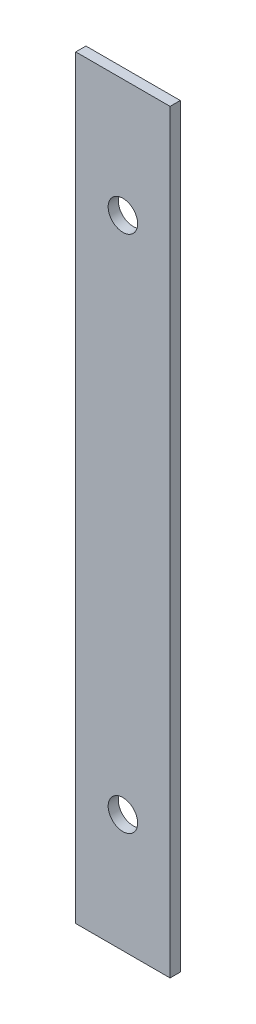
ISO-10303-21;
HEADER;
FILE_DESCRIPTION(('STEP AP214'),'2;1');
FILE_NAME('part.step','',(''),(''),'','','');
FILE_SCHEMA(('AUTOMOTIVE_DESIGN { 1 0 10303 214 1 1 1 1 }'));
ENDSEC;
DATA;
#1=APPLICATION_CONTEXT('core data for automotive mechanical design processes');
#2=APPLICATION_PROTOCOL_DEFINITION('international standard','automotive_design',2000,#1);
#3=PRODUCT_CONTEXT('',#1,'mechanical');
#4=PRODUCT('Part','Part','',(#3));
#5=PRODUCT_RELATED_PRODUCT_CATEGORY('part','',(#4));
#6=PRODUCT_DEFINITION_FORMATION('','',#4);
#7=PRODUCT_DEFINITION_CONTEXT('part definition',#1,'design');
#8=PRODUCT_DEFINITION('design','',#6,#7);
#9=PRODUCT_DEFINITION_SHAPE('','',#8);
#10=(LENGTH_UNIT() NAMED_UNIT(*) SI_UNIT(.MILLI.,.METRE.));
#11=(NAMED_UNIT(*) PLANE_ANGLE_UNIT() SI_UNIT($,.RADIAN.));
#12=(NAMED_UNIT(*) SI_UNIT($,.STERADIAN.) SOLID_ANGLE_UNIT());
#13=UNCERTAINTY_MEASURE_WITH_UNIT(LENGTH_MEASURE(1.E-05),#10,'distance_accuracy_value','');
#14=(GEOMETRIC_REPRESENTATION_CONTEXT(3) GLOBAL_UNCERTAINTY_ASSIGNED_CONTEXT((#13)) GLOBAL_UNIT_ASSIGNED_CONTEXT((#10,
#11,#12)) REPRESENTATION_CONTEXT('',''));
#15=CARTESIAN_POINT('',(0.,0.,0.));
#16=DIRECTION('',(0.,0.,1.));
#17=DIRECTION('',(1.,0.,0.));
#18=AXIS2_PLACEMENT_3D('',#15,#16,#17);
#19=CARTESIAN_POINT('',(0.,203.2,0.));
#20=DIRECTION('',(1.,0.,0.));
#21=DIRECTION('',(0.,0.,-1.));
#22=AXIS2_PLACEMENT_3D('',#19,#20,#21);
#23=PLANE('',#22);
#24=DIRECTION('',(0.,0.,1.));
#25=VECTOR('',#24,1.);
#26=CARTESIAN_POINT('',(0.,0.,0.));
#27=LINE('',#26,#25);
#28=CARTESIAN_POINT('',(0.,0.,0.));
#29=VERTEX_POINT('',#28);
#30=CARTESIAN_POINT('',(0.,0.,2.7432));
#31=VERTEX_POINT('',#30);
#32=EDGE_CURVE('E109',#29,#31,#27,.T.);
#33=ORIENTED_EDGE('',*,*,#32,.T.);
#34=DIRECTION('',(0.,-1.,0.));
#35=VECTOR('',#34,1.);
#36=CARTESIAN_POINT('',(0.,203.2,2.7432));
#37=LINE('',#36,#35);
#38=CARTESIAN_POINT('',(0.,203.2,2.7432));
#39=VERTEX_POINT('',#38);
#40=EDGE_CURVE('E11',#39,#31,#37,.T.);
#41=ORIENTED_EDGE('',*,*,#40,.F.);
#42=DIRECTION('',(0.,0.,1.));
#43=VECTOR('',#42,1.);
#44=CARTESIAN_POINT('',(0.,203.2,0.));
#45=LINE('',#44,#43);
#46=CARTESIAN_POINT('',(0.,203.2,0.));
#47=VERTEX_POINT('',#46);
#48=EDGE_CURVE('E97',#47,#39,#45,.T.);
#49=ORIENTED_EDGE('',*,*,#48,.F.);
#50=DIRECTION('',(0.,-1.,0.));
#51=VECTOR('',#50,1.);
#52=CARTESIAN_POINT('',(0.,203.2,0.));
#53=LINE('',#52,#51);
#54=EDGE_CURVE('E105',#47,#29,#53,.T.);
#55=ORIENTED_EDGE('',*,*,#54,.T.);
#56=EDGE_LOOP('',(#33,#41,#49,#55));
#57=FACE_BOUND('',#56,.T.);
#58=ADVANCED_FACE('F46',(#57),#23,.F.);
#59=CARTESIAN_POINT('',(0.,203.2,2.7432));
#60=DIRECTION('',(0.,0.,-1.));
#61=DIRECTION('',(-1.,0.,0.));
#62=AXIS2_PLACEMENT_3D('',#59,#60,#61);
#63=PLANE('',#62);
#64=CARTESIAN_POINT('',(12.7000000000031,31.7499999999723,2.7432));
#65=DIRECTION('',(0.,0.,-1.));
#66=DIRECTION('',(-1.,0.,0.));
#67=AXIS2_PLACEMENT_3D('',#64,#65,#66);
#68=CIRCLE('',#67,3.96875);
#69=CARTESIAN_POINT('',(8.73125000000313,31.7499999999723,2.7432));
#70=VERTEX_POINT('',#69);
#71=EDGE_CURVE('E112',#70,#70,#68,.T.);
#72=ORIENTED_EDGE('',*,*,#71,.T.);
#73=EDGE_LOOP('',(#72));
#74=FACE_BOUND('',#73,.T.);
#75=CARTESIAN_POINT('',(12.7000000000031,171.449999999994,2.7432));
#76=DIRECTION('',(0.,0.,-1.));
#77=DIRECTION('',(-1.,0.,0.));
#78=AXIS2_PLACEMENT_3D('',#75,#76,#77);
#79=CIRCLE('',#78,3.96875000000001);
#80=CARTESIAN_POINT('',(8.73125000000313,171.449999999994,2.7432));
#81=VERTEX_POINT('',#80);
#82=EDGE_CURVE('E125',#81,#81,#79,.T.);
#83=ORIENTED_EDGE('',*,*,#82,.T.);
#84=EDGE_LOOP('',(#83));
#85=FACE_BOUND('',#84,.T.);
#86=DIRECTION('',(1.,0.,0.));
#87=VECTOR('',#86,1.);
#88=CARTESIAN_POINT('',(0.,0.,2.7432));
#89=LINE('',#88,#87);
#90=CARTESIAN_POINT('',(25.4,0.,2.7432));
#91=VERTEX_POINT('',#90);
#92=EDGE_CURVE('E101',#31,#91,#89,.T.);
#93=ORIENTED_EDGE('',*,*,#92,.T.);
#94=DIRECTION('',(0.,-1.,0.));
#95=VECTOR('',#94,1.);
#96=CARTESIAN_POINT('',(25.4,203.2,2.7432));
#97=LINE('',#96,#95);
#98=CARTESIAN_POINT('',(25.4,203.2,2.7432));
#99=VERTEX_POINT('',#98);
#100=EDGE_CURVE('E54',#99,#91,#97,.T.);
#101=ORIENTED_EDGE('',*,*,#100,.F.);
#102=DIRECTION('',(1.,0.,0.));
#103=VECTOR('',#102,1.);
#104=CARTESIAN_POINT('',(0.,203.2,2.7432));
#105=LINE('',#104,#103);
#106=EDGE_CURVE('E92',#39,#99,#105,.T.);
#107=ORIENTED_EDGE('',*,*,#106,.F.);
#108=ORIENTED_EDGE('',*,*,#40,.T.);
#109=EDGE_LOOP('',(#93,#101,#107,#108));
#110=FACE_BOUND('',#109,.T.);
#111=ADVANCED_FACE('F100',(#74,#85,#110),#63,.F.);
#112=CARTESIAN_POINT('',(25.4,203.2,0.));
#113=DIRECTION('',(-1.,0.,0.));
#114=DIRECTION('',(0.,0.,1.));
#115=AXIS2_PLACEMENT_3D('',#112,#113,#114);
#116=PLANE('',#115);
#117=DIRECTION('',(0.,0.,-1.));
#118=VECTOR('',#117,1.);
#119=CARTESIAN_POINT('',(25.4,0.,0.));
#120=LINE('',#119,#118);
#121=CARTESIAN_POINT('',(25.4,0.,0.));
#122=VERTEX_POINT('',#121);
#123=EDGE_CURVE('E79',#91,#122,#120,.T.);
#124=ORIENTED_EDGE('',*,*,#123,.T.);
#125=DIRECTION('',(0.,-1.,0.));
#126=VECTOR('',#125,1.);
#127=CARTESIAN_POINT('',(25.4,203.2,0.));
#128=LINE('',#127,#126);
#129=CARTESIAN_POINT('',(25.4,203.2,0.));
#130=VERTEX_POINT('',#129);
#131=EDGE_CURVE('E102',#130,#122,#128,.T.);
#132=ORIENTED_EDGE('',*,*,#131,.F.);
#133=DIRECTION('',(0.,0.,-1.));
#134=VECTOR('',#133,1.);
#135=CARTESIAN_POINT('',(25.4,203.2,0.));
#136=LINE('',#135,#134);
#137=EDGE_CURVE('E95',#99,#130,#136,.T.);
#138=ORIENTED_EDGE('',*,*,#137,.F.);
#139=ORIENTED_EDGE('',*,*,#100,.T.);
#140=EDGE_LOOP('',(#124,#132,#138,#139));
#141=FACE_BOUND('',#140,.T.);
#142=ADVANCED_FACE('F103',(#141),#116,.F.);
#143=CARTESIAN_POINT('',(0.,203.2,0.));
#144=DIRECTION('',(0.,0.,1.));
#145=DIRECTION('',(1.,0.,0.));
#146=AXIS2_PLACEMENT_3D('',#143,#144,#145);
#147=PLANE('',#146);
#148=CARTESIAN_POINT('',(12.7000000000031,31.7499999999723,0.));
#149=DIRECTION('',(0.,0.,1.));
#150=DIRECTION('',(-1.,0.,0.));
#151=AXIS2_PLACEMENT_3D('',#148,#149,#150);
#152=CIRCLE('',#151,3.96875);
#153=CARTESIAN_POINT('',(8.73125000000313,31.7499999999723,0.));
#154=VERTEX_POINT('',#153);
#155=EDGE_CURVE('E128',#154,#154,#152,.T.);
#156=ORIENTED_EDGE('',*,*,#155,.T.);
#157=EDGE_LOOP('',(#156));
#158=FACE_BOUND('',#157,.T.);
#159=CARTESIAN_POINT('',(12.7000000000031,171.449999999994,0.));
#160=DIRECTION('',(0.,0.,1.));
#161=DIRECTION('',(1.,0.,0.));
#162=AXIS2_PLACEMENT_3D('',#159,#160,#161);
#163=CIRCLE('',#162,3.96875000000001);
#164=CARTESIAN_POINT('',(16.6687500000031,171.449999999994,0.));
#165=VERTEX_POINT('',#164);
#166=EDGE_CURVE('E129',#165,#165,#163,.T.);
#167=ORIENTED_EDGE('',*,*,#166,.T.);
#168=EDGE_LOOP('',(#167));
#169=FACE_BOUND('',#168,.T.);
#170=DIRECTION('',(-1.,0.,0.));
#171=VECTOR('',#170,1.);
#172=CARTESIAN_POINT('',(0.,0.,0.));
#173=LINE('',#172,#171);
#174=EDGE_CURVE('E85',#122,#29,#173,.T.);
#175=ORIENTED_EDGE('',*,*,#174,.T.);
#176=ORIENTED_EDGE('',*,*,#54,.F.);
#177=DIRECTION('',(-1.,0.,0.));
#178=VECTOR('',#177,1.);
#179=CARTESIAN_POINT('',(0.,203.2,0.));
#180=LINE('',#179,#178);
#181=EDGE_CURVE('E62',#130,#47,#180,.T.);
#182=ORIENTED_EDGE('',*,*,#181,.F.);
#183=ORIENTED_EDGE('',*,*,#131,.T.);
#184=EDGE_LOOP('',(#175,#176,#182,#183));
#185=FACE_BOUND('',#184,.T.);
#186=ADVANCED_FACE('F117',(#158,#169,#185),#147,.F.);
#187=CARTESIAN_POINT('',(0.,203.2,0.));
#188=DIRECTION('',(0.,1.,0.));
#189=DIRECTION('',(0.,0.,1.));
#190=AXIS2_PLACEMENT_3D('',#187,#188,#189);
#191=PLANE('',#190);
#192=ORIENTED_EDGE('',*,*,#48,.T.);
#193=ORIENTED_EDGE('',*,*,#106,.T.);
#194=ORIENTED_EDGE('',*,*,#137,.T.);
#195=ORIENTED_EDGE('',*,*,#181,.T.);
#196=EDGE_LOOP('',(#192,#193,#194,#195));
#197=FACE_BOUND('',#196,.T.);
#198=ADVANCED_FACE('F93',(#197),#191,.T.);
#199=CARTESIAN_POINT('',(0.,0.,0.));
#200=DIRECTION('',(0.,1.,0.));
#201=DIRECTION('',(0.,0.,1.));
#202=AXIS2_PLACEMENT_3D('',#199,#200,#201);
#203=PLANE('',#202);
#204=ORIENTED_EDGE('',*,*,#32,.F.);
#205=ORIENTED_EDGE('',*,*,#174,.F.);
#206=ORIENTED_EDGE('',*,*,#123,.F.);
#207=ORIENTED_EDGE('',*,*,#92,.F.);
#208=EDGE_LOOP('',(#204,#205,#206,#207));
#209=FACE_BOUND('',#208,.T.);
#210=ADVANCED_FACE('F120',(#209),#203,.F.);
#211=CARTESIAN_POINT('',(12.7000000000031,171.449999999994,0.));
#212=DIRECTION('',(0.,0.,1.));
#213=DIRECTION('',(1.,0.,0.));
#214=AXIS2_PLACEMENT_3D('',#211,#212,#213);
#215=CYLINDRICAL_SURFACE('',#214,3.96875000000001);
#216=ORIENTED_EDGE('',*,*,#166,.F.);
#217=EDGE_LOOP('',(#216));
#218=FACE_BOUND('',#217,.T.);
#219=ORIENTED_EDGE('',*,*,#82,.F.);
#220=EDGE_LOOP('',(#219));
#221=FACE_BOUND('',#220,.T.);
#222=ADVANCED_FACE('F140',(#218,#221),#215,.F.);
#223=CARTESIAN_POINT('',(12.7000000000031,31.7499999999723,0.));
#224=DIRECTION('',(0.,0.,1.));
#225=DIRECTION('',(1.,0.,0.));
#226=AXIS2_PLACEMENT_3D('',#223,#224,#225);
#227=CYLINDRICAL_SURFACE('',#226,3.96875);
#228=ORIENTED_EDGE('',*,*,#155,.F.);
#229=EDGE_LOOP('',(#228));
#230=FACE_BOUND('',#229,.T.);
#231=ORIENTED_EDGE('',*,*,#71,.F.);
#232=EDGE_LOOP('',(#231));
#233=FACE_BOUND('',#232,.T.);
#234=ADVANCED_FACE('F137',(#230,#233),#227,.F.);
#235=CLOSED_SHELL('',(#58,#111,#142,#186,#198,#210,#222,#234));
#236=MANIFOLD_SOLID_BREP('B2',#235);
#237=ADVANCED_BREP_SHAPE_REPRESENTATION('',(#18,#236),#14);
#238=SHAPE_DEFINITION_REPRESENTATION(#9,#237);
ENDSEC;
END-ISO-10303-21;
